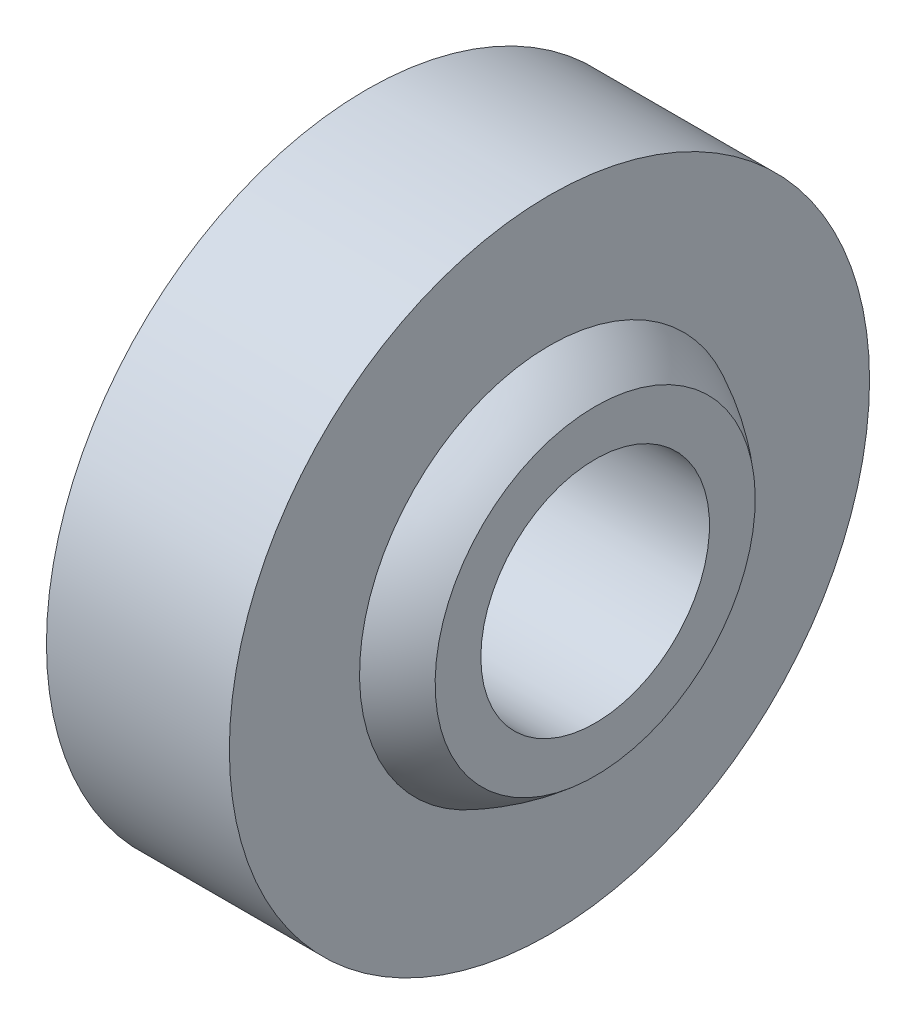
ISO-10303-21;
HEADER;
FILE_DESCRIPTION(('STEP AP214'),'2;1');
FILE_NAME('part.step','',(''),(''),'','','');
FILE_SCHEMA(('AUTOMOTIVE_DESIGN { 1 0 10303 214 1 1 1 1 }'));
ENDSEC;
DATA;
#1=APPLICATION_CONTEXT('core data for automotive mechanical design processes');
#2=APPLICATION_PROTOCOL_DEFINITION('international standard','automotive_design',2000,#1);
#3=PRODUCT_CONTEXT('',#1,'mechanical');
#4=PRODUCT('Part','Part','',(#3));
#5=PRODUCT_RELATED_PRODUCT_CATEGORY('part','',(#4));
#6=PRODUCT_DEFINITION_FORMATION('','',#4);
#7=PRODUCT_DEFINITION_CONTEXT('part definition',#1,'design');
#8=PRODUCT_DEFINITION('design','',#6,#7);
#9=PRODUCT_DEFINITION_SHAPE('','',#8);
#10=(LENGTH_UNIT() NAMED_UNIT(*) SI_UNIT(.MILLI.,.METRE.));
#11=(NAMED_UNIT(*) PLANE_ANGLE_UNIT() SI_UNIT($,.RADIAN.));
#12=(NAMED_UNIT(*) SI_UNIT($,.STERADIAN.) SOLID_ANGLE_UNIT());
#13=UNCERTAINTY_MEASURE_WITH_UNIT(LENGTH_MEASURE(1.E-05),#10,'distance_accuracy_value','');
#14=(GEOMETRIC_REPRESENTATION_CONTEXT(3) GLOBAL_UNCERTAINTY_ASSIGNED_CONTEXT((#13)) GLOBAL_UNIT_ASSIGNED_CONTEXT((#10,
#11,#12)) REPRESENTATION_CONTEXT('',''));
#15=CARTESIAN_POINT('',(0.,0.,0.));
#16=DIRECTION('',(0.,0.,1.));
#17=DIRECTION('',(1.,0.,0.));
#18=AXIS2_PLACEMENT_3D('',#15,#16,#17);
#19=CARTESIAN_POINT('',(0.,0.,0.));
#20=DIRECTION('',(-1.,0.,0.));
#21=DIRECTION('',(0.,1.,0.));
#22=AXIS2_PLACEMENT_3D('',#19,#20,#21);
#23=SPHERICAL_SURFACE('',#22,4.60977222864644);
#24=CARTESIAN_POINT('',(-3.,0.,0.));
#25=DIRECTION('',(-1.,0.,0.));
#26=DIRECTION('',(0.,0.,1.));
#27=AXIS2_PLACEMENT_3D('',#24,#25,#26);
#28=CIRCLE('',#27,3.5);
#29=CARTESIAN_POINT('',(-3.,3.5,0.));
#30=VERTEX_POINT('',#29);
#31=EDGE_CURVE('E49',#30,#30,#28,.T.);
#32=CARTESIAN_POINT('',(-2.,0.,0.));
#33=DIRECTION('',(1.,0.,0.));
#34=DIRECTION('',(0.,0.,-1.));
#35=AXIS2_PLACEMENT_3D('',#32,#33,#34);
#36=CIRCLE('',#35,4.15331193145904);
#37=CARTESIAN_POINT('',(-2.,4.15331193145904,0.));
#38=VERTEX_POINT('',#37);
#39=EDGE_CURVE('E10',#38,#38,#36,.T.);
#40=CARTESIAN_POINT('',(-3.,3.5,0.));
#41=CARTESIAN_POINT('',(-2.99052620611061,3.50812039634238,0.));
#42=CARTESIAN_POINT('',(-2.98101944028967,3.51620232540534,0.));
#43=CARTESIAN_POINT('',(-2.96194059506185,3.53228872007487,0.));
#44=CARTESIAN_POINT('',(-2.95236851565497,3.54029318568143,0.));
#45=CARTESIAN_POINT('',(-2.93315967353245,3.55622412454056,0.));
#46=CARTESIAN_POINT('',(-2.92352291081681,3.56415059779313,0.));
#47=CARTESIAN_POINT('',(-2.90418533777321,3.57992502955823,0.));
#48=CARTESIAN_POINT('',(-2.89448452744525,3.58777298807076,0.));
#49=CARTESIAN_POINT('',(-2.87501949878755,3.60338987278029,0.));
#50=CARTESIAN_POINT('',(-2.86525528045781,3.61115879897729,0.));
#51=CARTESIAN_POINT('',(-2.8456640796711,3.62661710678996,0.));
#52=CARTESIAN_POINT('',(-2.83583709721413,3.63430648840563,0.));
#53=CARTESIAN_POINT('',(-2.81612101616401,3.64960520000871,0.));
#54=CARTESIAN_POINT('',(-2.80623191757087,3.65721452999613,0.));
#55=CARTESIAN_POINT('',(-2.78639225634135,3.67235263658149,0.));
#56=CARTESIAN_POINT('',(-2.77644169370499,3.67988141317943,0.));
#57=CARTESIAN_POINT('',(-2.75647976053338,3.69485791653445,0.));
#58=CARTESIAN_POINT('',(-2.74646838999813,3.70230564329153,0.));
#59=CARTESIAN_POINT('',(-2.72638550118322,3.71711955585841,0.));
#60=CARTESIAN_POINT('',(-2.71631398290356,3.72448574166821,0.));
#61=CARTESIAN_POINT('',(-2.69611146272033,3.73913608661081,0.));
#62=CARTESIAN_POINT('',(-2.68598046081677,3.74642024574362,0.));
#63=CARTESIAN_POINT('',(-2.66565964142868,3.76090605701146,0.));
#64=CARTESIAN_POINT('',(-2.65546982394415,3.76810770914649,0.));
#65=CARTESIAN_POINT('',(-2.63503204531536,3.78242803153852,0.));
#66=CARTESIAN_POINT('',(-2.6247840841711,3.78954670179551,0.));
#67=CARTESIAN_POINT('',(-2.60423069397813,3.80370059102309,0.));
#68=CARTESIAN_POINT('',(-2.59392526492941,3.81073580999366,0.));
#69=CARTESIAN_POINT('',(-2.57325761847225,3.82472233274282,0.));
#70=CARTESIAN_POINT('',(-2.56289540106381,3.83167363652141,0.));
#71=CARTESIAN_POINT('',(-2.54211486117656,3.84549187051442,0.));
#72=CARTESIAN_POINT('',(-2.53169653869776,3.85235880072884,0.));
#73=CARTESIAN_POINT('',(-2.51080447565878,3.866007834785,0.));
#74=CARTESIAN_POINT('',(-2.5003307350986,3.87278993862674,0.));
#75=CARTESIAN_POINT('',(-2.47932852654012,3.88626887272247,0.));
#76=CARTESIAN_POINT('',(-2.46880005854182,3.89296570297647,0.));
#77=CARTESIAN_POINT('',(-2.44768908935913,3.90627364830467,0.));
#78=CARTESIAN_POINT('',(-2.43710658817473,3.91288476337887,0.));
#79=CARTESIAN_POINT('',(-2.41588825043483,3.9260208424075,0.));
#80=CARTESIAN_POINT('',(-2.40525241387933,3.93254580636194,0.));
#81=CARTESIAN_POINT('',(-2.38392810672916,3.94550915289192,0.));
#82=CARTESIAN_POINT('',(-2.3732396361345,3.95194753546746,0.));
#83=CARTESIAN_POINT('',(-2.35181076570868,3.96473729468976,0.));
#84=CARTESIAN_POINT('',(-2.34107036587753,3.97108867133652,0.));
#85=CARTESIAN_POINT('',(-2.31953834520562,3.98370399988854,0.));
#86=CARTESIAN_POINT('',(-2.30874672436486,3.9899679517938,0.));
#87=CARTESIAN_POINT('',(-2.28711297327821,4.002408017815,0.));
#88=CARTESIAN_POINT('',(-2.27627084303231,4.00858413193093,0.));
#89=CARTESIAN_POINT('',(-2.25453678807035,4.02084811511754,0.));
#90=CARTESIAN_POINT('',(-2.2436448633543,4.02693598418822,0.));
#91=CARTESIAN_POINT('',(-2.22181193767078,4.03902307584791,0.));
#92=CARTESIAN_POINT('',(-2.21087093670332,4.04502229843691,0.));
#93=CARTESIAN_POINT('',(-2.18894057997077,4.05693170154001,0.));
#94=CARTESIAN_POINT('',(-2.17795122420567,4.0628418820541,0.));
#95=CARTESIAN_POINT('',(-2.15592488252423,4.07457281129388,0.));
#96=CARTESIAN_POINT('',(-2.14488789660788,4.08039356001957,0.));
#97=CARTESIAN_POINT('',(-2.12276702239587,4.09194524183532,0.));
#98=CARTESIAN_POINT('',(-2.11168313410021,4.09767617492539,0.));
#99=CARTESIAN_POINT('',(-2.08946918605098,4.1090478476605,0.));
#100=CARTESIAN_POINT('',(-2.07833912629741,4.11468858730555,0.));
#101=CARTESIAN_POINT('',(-2.05603356908673,4.12587950085816,0.));
#102=CARTESIAN_POINT('',(-2.04485807162961,4.13142967476571,0.));
#103=CARTESIAN_POINT('',(-2.02246237655214,4.14243909212941,0.));
#104=CARTESIAN_POINT('',(-2.01124217893179,4.14789833558556,0.));
#105=CARTESIAN_POINT('',(-2.,4.15331193145904,0.));
#106=B_SPLINE_CURVE_WITH_KNOTS('',3,(#40,#41,#42,#43,#44,#45,#46,#47,#48,#49,#50,#51,#52,#53,
#54,#55,#56,#57,#58,#59,#60,#61,#62,#63,#64,#65,#66,#67,#68,#69,#70,#71,#72,#73,#74,#75,#76,#77,
#78,#79,#80,#81,#82,#83,#84,#85,#86,#87,#88,#89,#90,#91,#92,#93,#94,#95,#96,#97,#98,#99,#100,
#101,#102,#103,#104,#105),.UNSPECIFIED.,.F.,.F.,(4,2,2,2,2,2,2,2,2,2,2,2,2,2,2,2,2,2,2,2,2,2,2,
2,2,2,2,2,2,2,2,2,4),(0.,0.0374330704687181,0.0748661409374359,0.112299211406154,
0.149732281874872,0.187165352343589,0.224598422812307,0.262031493281025,0.299464563749743,
0.336897634218461,0.374330704687179,0.411763775155897,0.449196845624614,0.486629916093332,
0.52406298656205,0.561496057030768,0.598929127499486,0.636362197968204,0.673795268436922,
0.711228338905639,0.748661409374358,0.786094479843075,0.823527550311794,0.860960620780511,
0.898393691249229,0.935826761717947,0.973259832186665,1.01069290265538,1.0481259731241,
1.08555904359282,1.12299211406154,1.16042518453025,1.19785825499897),.UNSPECIFIED.);
#107=EDGE_CURVE('BSEAM39',#30,#38,#106,.T.);
#108=ORIENTED_EDGE('',*,*,#31,.F.);
#109=ORIENTED_EDGE('',*,*,#39,.F.);
#110=ORIENTED_EDGE('',*,*,#107,.T.);
#111=ORIENTED_EDGE('',*,*,#107,.F.);
#112=EDGE_LOOP('',(#108,#110,#109,#111));
#113=FACE_BOUND('',#112,.T.);
#114=ADVANCED_FACE('F39',(#113),#23,.T.);
#115=CARTESIAN_POINT('',(3.,0.,0.));
#116=DIRECTION('',(-1.,0.,0.));
#117=DIRECTION('',(0.,0.,1.));
#118=AXIS2_PLACEMENT_3D('',#115,#116,#117);
#119=CIRCLE('',#118,3.5);
#120=CARTESIAN_POINT('',(3.,3.5,0.));
#121=VERTEX_POINT('',#120);
#122=EDGE_CURVE('E61',#121,#121,#119,.T.);
#123=CARTESIAN_POINT('',(2.,0.,0.));
#124=DIRECTION('',(-1.,0.,0.));
#125=DIRECTION('',(0.,0.,1.));
#126=AXIS2_PLACEMENT_3D('',#123,#124,#125);
#127=CIRCLE('',#126,4.15331193145904);
#128=CARTESIAN_POINT('',(2.,4.15331193145904,0.));
#129=VERTEX_POINT('',#128);
#130=EDGE_CURVE('E45',#129,#129,#127,.T.);
#131=CARTESIAN_POINT('',(3.,3.5,0.));
#132=CARTESIAN_POINT('',(2.99052620611061,3.50812039634238,0.));
#133=CARTESIAN_POINT('',(2.98101944028967,3.51620232540534,0.));
#134=CARTESIAN_POINT('',(2.96194059506185,3.53228872007487,0.));
#135=CARTESIAN_POINT('',(2.95236851565497,3.54029318568143,0.));
#136=CARTESIAN_POINT('',(2.93315967353245,3.55622412454056,0.));
#137=CARTESIAN_POINT('',(2.92352291081681,3.56415059779313,0.));
#138=CARTESIAN_POINT('',(2.90418533777321,3.57992502955823,0.));
#139=CARTESIAN_POINT('',(2.89448452744525,3.58777298807076,0.));
#140=CARTESIAN_POINT('',(2.87501949878755,3.60338987278029,0.));
#141=CARTESIAN_POINT('',(2.86525528045781,3.61115879897729,0.));
#142=CARTESIAN_POINT('',(2.8456640796711,3.62661710678996,0.));
#143=CARTESIAN_POINT('',(2.83583709721413,3.63430648840563,0.));
#144=CARTESIAN_POINT('',(2.81612101616401,3.64960520000871,0.));
#145=CARTESIAN_POINT('',(2.80623191757086,3.65721452999613,0.));
#146=CARTESIAN_POINT('',(2.78639225634135,3.67235263658149,0.));
#147=CARTESIAN_POINT('',(2.77644169370499,3.67988141317943,0.));
#148=CARTESIAN_POINT('',(2.75647976053338,3.69485791653445,0.));
#149=CARTESIAN_POINT('',(2.74646838999813,3.70230564329153,0.));
#150=CARTESIAN_POINT('',(2.72638550118322,3.71711955585841,0.));
#151=CARTESIAN_POINT('',(2.71631398290356,3.72448574166821,0.));
#152=CARTESIAN_POINT('',(2.69611146272034,3.73913608661081,0.));
#153=CARTESIAN_POINT('',(2.68598046081677,3.74642024574362,0.));
#154=CARTESIAN_POINT('',(2.66565964142868,3.76090605701146,0.));
#155=CARTESIAN_POINT('',(2.65546982394415,3.76810770914649,0.));
#156=CARTESIAN_POINT('',(2.63503204531536,3.78242803153852,0.));
#157=CARTESIAN_POINT('',(2.6247840841711,3.78954670179551,0.));
#158=CARTESIAN_POINT('',(2.60423069397813,3.80370059102309,0.));
#159=CARTESIAN_POINT('',(2.59392526492941,3.81073580999366,0.));
#160=CARTESIAN_POINT('',(2.57325761847225,3.82472233274282,0.));
#161=CARTESIAN_POINT('',(2.56289540106381,3.83167363652141,0.));
#162=CARTESIAN_POINT('',(2.54211486117656,3.84549187051441,0.));
#163=CARTESIAN_POINT('',(2.53169653869776,3.85235880072884,0.));
#164=CARTESIAN_POINT('',(2.51080447565878,3.866007834785,0.));
#165=CARTESIAN_POINT('',(2.5003307350986,3.87278993862674,0.));
#166=CARTESIAN_POINT('',(2.47932852654012,3.88626887272247,0.));
#167=CARTESIAN_POINT('',(2.46880005854182,3.89296570297647,0.));
#168=CARTESIAN_POINT('',(2.44768908935913,3.90627364830467,0.));
#169=CARTESIAN_POINT('',(2.43710658817473,3.91288476337887,0.));
#170=CARTESIAN_POINT('',(2.41588825043483,3.9260208424075,0.));
#171=CARTESIAN_POINT('',(2.40525241387933,3.93254580636194,0.));
#172=CARTESIAN_POINT('',(2.38392810672916,3.94550915289192,0.));
#173=CARTESIAN_POINT('',(2.3732396361345,3.95194753546746,0.));
#174=CARTESIAN_POINT('',(2.35181076570868,3.96473729468976,0.));
#175=CARTESIAN_POINT('',(2.34107036587753,3.97108867133652,0.));
#176=CARTESIAN_POINT('',(2.31953834520562,3.98370399988854,0.));
#177=CARTESIAN_POINT('',(2.30874672436486,3.9899679517938,0.));
#178=CARTESIAN_POINT('',(2.28711297327821,4.002408017815,0.));
#179=CARTESIAN_POINT('',(2.27627084303231,4.00858413193093,0.));
#180=CARTESIAN_POINT('',(2.25453678807035,4.02084811511754,0.));
#181=CARTESIAN_POINT('',(2.2436448633543,4.02693598418822,0.));
#182=CARTESIAN_POINT('',(2.22181193767078,4.03902307584791,0.));
#183=CARTESIAN_POINT('',(2.21087093670332,4.04502229843691,0.));
#184=CARTESIAN_POINT('',(2.18894057997077,4.05693170154001,0.));
#185=CARTESIAN_POINT('',(2.17795122420567,4.0628418820541,0.));
#186=CARTESIAN_POINT('',(2.15592488252423,4.07457281129388,0.));
#187=CARTESIAN_POINT('',(2.14488789660788,4.08039356001957,0.));
#188=CARTESIAN_POINT('',(2.12276702239587,4.09194524183532,0.));
#189=CARTESIAN_POINT('',(2.11168313410021,4.09767617492539,0.));
#190=CARTESIAN_POINT('',(2.08946918605098,4.1090478476605,0.));
#191=CARTESIAN_POINT('',(2.07833912629741,4.11468858730555,0.));
#192=CARTESIAN_POINT('',(2.05603356908673,4.12587950085816,0.));
#193=CARTESIAN_POINT('',(2.04485807162961,4.13142967476571,0.));
#194=CARTESIAN_POINT('',(2.02246237655214,4.14243909212941,0.));
#195=CARTESIAN_POINT('',(2.01124217893179,4.14789833558556,0.));
#196=CARTESIAN_POINT('',(2.,4.15331193145904,0.));
#197=B_SPLINE_CURVE_WITH_KNOTS('',3,(#131,#132,#133,#134,#135,#136,#137,#138,#139,#140,#141,
#142,#143,#144,#145,#146,#147,#148,#149,#150,#151,#152,#153,#154,#155,#156,#157,#158,#159,#160,
#161,#162,#163,#164,#165,#166,#167,#168,#169,#170,#171,#172,#173,#174,#175,#176,#177,#178,#179,
#180,#181,#182,#183,#184,#185,#186,#187,#188,#189,#190,#191,#192,#193,#194,#195,#196),
.UNSPECIFIED.,.F.,.F.,(4,2,2,2,2,2,2,2,2,2,2,2,2,2,2,2,2,2,2,2,2,2,2,2,2,2,2,2,2,2,2,2,4),(0.,
0.0374330704687175,0.0748661409374359,0.112299211406154,0.149732281874872,0.18716535234359,
0.224598422812308,0.262031493281025,0.299464563749743,0.336897634218461,0.374330704687179,
0.411763775155897,0.449196845624615,0.486629916093333,0.524062986562051,0.561496057030768,
0.598929127499487,0.636362197968205,0.673795268436923,0.711228338905641,0.748661409374359,
0.786094479843076,0.823527550311795,0.860960620780512,0.89839369124923,0.935826761717948,
0.973259832186667,1.01069290265538,1.0481259731241,1.08555904359282,1.12299211406154,
1.16042518453026,1.19785825499897),.UNSPECIFIED.);
#198=EDGE_CURVE('BSEAM88',#121,#129,#197,.T.);
#199=ORIENTED_EDGE('',*,*,#122,.T.);
#200=ORIENTED_EDGE('',*,*,#130,.F.);
#201=ORIENTED_EDGE('',*,*,#198,.T.);
#202=ORIENTED_EDGE('',*,*,#198,.F.);
#203=EDGE_LOOP('',(#199,#201,#200,#202));
#204=FACE_BOUND('',#203,.T.);
#205=ADVANCED_FACE('F88',(#204),#23,.T.);
#206=CARTESIAN_POINT('',(-3.,3.5,0.));
#207=DIRECTION('',(1.,0.,0.));
#208=DIRECTION('',(0.,0.,-1.));
#209=AXIS2_PLACEMENT_3D('',#206,#207,#208);
#210=PLANE('',#209);
#211=CARTESIAN_POINT('',(-3.,0.,0.));
#212=DIRECTION('',(-1.,0.,0.));
#213=DIRECTION('',(0.,0.,1.));
#214=AXIS2_PLACEMENT_3D('',#211,#212,#213);
#215=CIRCLE('',#214,2.5);
#216=CARTESIAN_POINT('',(-3.,0.,2.5));
#217=VERTEX_POINT('',#216);
#218=EDGE_CURVE('E53',#217,#217,#215,.T.);
#219=ORIENTED_EDGE('',*,*,#218,.F.);
#220=EDGE_LOOP('',(#219));
#221=FACE_BOUND('',#220,.T.);
#222=ORIENTED_EDGE('',*,*,#31,.T.);
#223=EDGE_LOOP('',(#222));
#224=FACE_BOUND('',#223,.T.);
#225=ADVANCED_FACE('F94',(#221,#224),#210,.F.);
#226=CARTESIAN_POINT('',(-2.95583633269187,0.,0.));
#227=DIRECTION('',(-1.,0.,0.));
#228=DIRECTION('',(0.,0.,1.));
#229=AXIS2_PLACEMENT_3D('',#226,#227,#228);
#230=CYLINDRICAL_SURFACE('',#229,2.5);
#231=CARTESIAN_POINT('',(3.,0.,0.));
#232=DIRECTION('',(-1.,0.,0.));
#233=DIRECTION('',(0.,0.,1.));
#234=AXIS2_PLACEMENT_3D('',#231,#232,#233);
#235=CIRCLE('',#234,2.5);
#236=CARTESIAN_POINT('',(3.,0.,2.5));
#237=VERTEX_POINT('',#236);
#238=EDGE_CURVE('E58',#237,#237,#235,.T.);
#239=ORIENTED_EDGE('',*,*,#238,.F.);
#240=EDGE_LOOP('',(#239));
#241=FACE_BOUND('',#240,.T.);
#242=ORIENTED_EDGE('',*,*,#218,.T.);
#243=EDGE_LOOP('',(#242));
#244=FACE_BOUND('',#243,.T.);
#245=ADVANCED_FACE('F100',(#241,#244),#230,.F.);
#246=CARTESIAN_POINT('',(3.,3.5,0.));
#247=DIRECTION('',(-1.,0.,0.));
#248=DIRECTION('',(0.,0.,1.));
#249=AXIS2_PLACEMENT_3D('',#246,#247,#248);
#250=PLANE('',#249);
#251=ORIENTED_EDGE('',*,*,#122,.F.);
#252=EDGE_LOOP('',(#251));
#253=FACE_BOUND('',#252,.T.);
#254=ORIENTED_EDGE('',*,*,#238,.T.);
#255=EDGE_LOOP('',(#254));
#256=FACE_BOUND('',#255,.T.);
#257=ADVANCED_FACE('F85',(#253,#256),#250,.F.);
#258=CARTESIAN_POINT('',(-2.,7.,0.));
#259=DIRECTION('',(1.,0.,0.));
#260=DIRECTION('',(0.,0.,-1.));
#261=AXIS2_PLACEMENT_3D('',#258,#259,#260);
#262=PLANE('',#261);
#263=ORIENTED_EDGE('',*,*,#39,.T.);
#264=EDGE_LOOP('',(#263));
#265=FACE_BOUND('',#264,.T.);
#266=CARTESIAN_POINT('',(-2.,0.,0.));
#267=DIRECTION('',(-1.,0.,0.));
#268=DIRECTION('',(0.,0.,1.));
#269=AXIS2_PLACEMENT_3D('',#266,#267,#268);
#270=CIRCLE('',#269,7.);
#271=CARTESIAN_POINT('',(-2.,0.,7.));
#272=VERTEX_POINT('',#271);
#273=EDGE_CURVE('E67',#272,#272,#270,.T.);
#274=ORIENTED_EDGE('',*,*,#273,.T.);
#275=EDGE_LOOP('',(#274));
#276=FACE_BOUND('',#275,.T.);
#277=ADVANCED_FACE('F71',(#265,#276),#262,.F.);
#278=CARTESIAN_POINT('',(2.,7.,0.));
#279=DIRECTION('',(-1.,0.,0.));
#280=DIRECTION('',(0.,0.,1.));
#281=AXIS2_PLACEMENT_3D('',#278,#279,#280);
#282=PLANE('',#281);
#283=CARTESIAN_POINT('',(2.,0.,0.));
#284=DIRECTION('',(-1.,0.,0.));
#285=DIRECTION('',(0.,0.,1.));
#286=AXIS2_PLACEMENT_3D('',#283,#284,#285);
#287=CIRCLE('',#286,7.);
#288=CARTESIAN_POINT('',(2.,0.,7.));
#289=VERTEX_POINT('',#288);
#290=EDGE_CURVE('E64',#289,#289,#287,.T.);
#291=ORIENTED_EDGE('',*,*,#290,.F.);
#292=EDGE_LOOP('',(#291));
#293=FACE_BOUND('',#292,.T.);
#294=ORIENTED_EDGE('',*,*,#130,.T.);
#295=EDGE_LOOP('',(#294));
#296=FACE_BOUND('',#295,.T.);
#297=ADVANCED_FACE('F76',(#293,#296),#282,.F.);
#298=CARTESIAN_POINT('',(-4.35580874527011,0.,0.));
#299=DIRECTION('',(-1.,0.,0.));
#300=DIRECTION('',(0.,0.,1.));
#301=AXIS2_PLACEMENT_3D('',#298,#299,#300);
#302=CYLINDRICAL_SURFACE('',#301,7.);
#303=ORIENTED_EDGE('',*,*,#273,.F.);
#304=EDGE_LOOP('',(#303));
#305=FACE_BOUND('',#304,.T.);
#306=ORIENTED_EDGE('',*,*,#290,.T.);
#307=EDGE_LOOP('',(#306));
#308=FACE_BOUND('',#307,.T.);
#309=ADVANCED_FACE('F73',(#305,#308),#302,.T.);
#310=CLOSED_SHELL('',(#114,#205,#225,#245,#257,#277,#297,#309));
#311=MANIFOLD_SOLID_BREP('B2',#310);
#312=ADVANCED_BREP_SHAPE_REPRESENTATION('',(#18,#311),#14);
#313=SHAPE_DEFINITION_REPRESENTATION(#9,#312);
ENDSEC;
END-ISO-10303-21;
